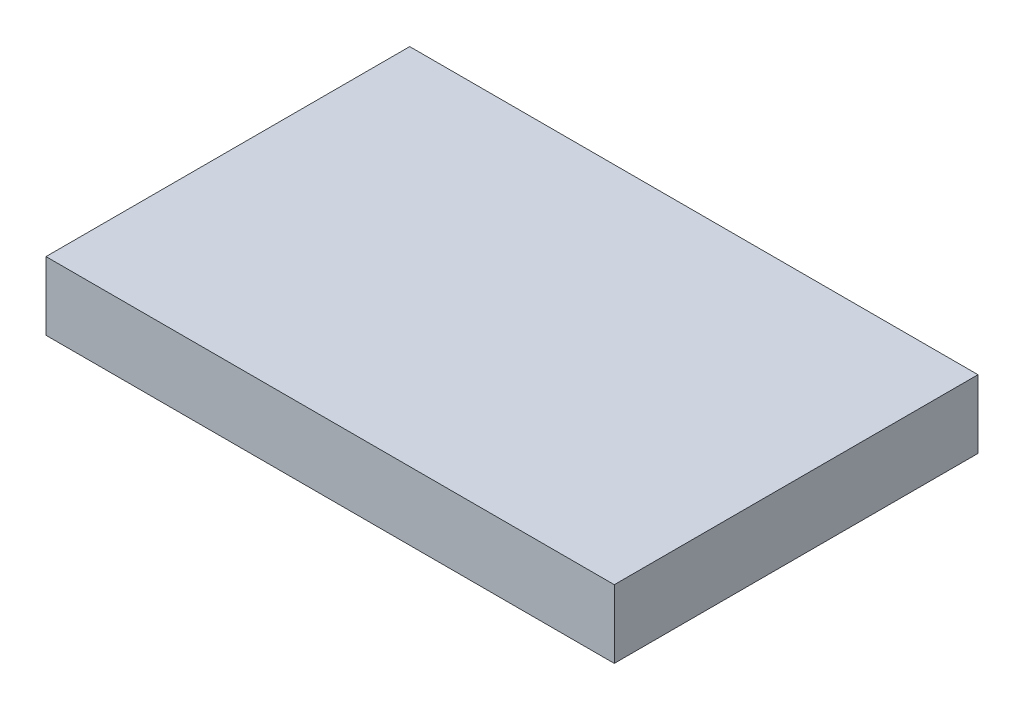
ISO-10303-21;
HEADER;
FILE_DESCRIPTION(('STEP AP214'),'2;1');
FILE_NAME('part.step','',(''),(''),'','','');
FILE_SCHEMA(('AUTOMOTIVE_DESIGN { 1 0 10303 214 1 1 1 1 }'));
ENDSEC;
DATA;
#1=APPLICATION_CONTEXT('core data for automotive mechanical design processes');
#2=APPLICATION_PROTOCOL_DEFINITION('international standard','automotive_design',2000,#1);
#3=PRODUCT_CONTEXT('',#1,'mechanical');
#4=PRODUCT('Part','Part','',(#3));
#5=PRODUCT_RELATED_PRODUCT_CATEGORY('part','',(#4));
#6=PRODUCT_DEFINITION_FORMATION('','',#4);
#7=PRODUCT_DEFINITION_CONTEXT('part definition',#1,'design');
#8=PRODUCT_DEFINITION('design','',#6,#7);
#9=PRODUCT_DEFINITION_SHAPE('','',#8);
#10=(LENGTH_UNIT() NAMED_UNIT(*) SI_UNIT(.MILLI.,.METRE.));
#11=(NAMED_UNIT(*) PLANE_ANGLE_UNIT() SI_UNIT($,.RADIAN.));
#12=(NAMED_UNIT(*) SI_UNIT($,.STERADIAN.) SOLID_ANGLE_UNIT());
#13=UNCERTAINTY_MEASURE_WITH_UNIT(LENGTH_MEASURE(1.E-05),#10,'distance_accuracy_value','');
#14=(GEOMETRIC_REPRESENTATION_CONTEXT(3) GLOBAL_UNCERTAINTY_ASSIGNED_CONTEXT((#13)) GLOBAL_UNIT_ASSIGNED_CONTEXT((#10,
#11,#12)) REPRESENTATION_CONTEXT('',''));
#15=CARTESIAN_POINT('',(0.,0.,0.));
#16=DIRECTION('',(0.,0.,1.));
#17=DIRECTION('',(1.,0.,0.));
#18=AXIS2_PLACEMENT_3D('',#15,#16,#17);
#19=CARTESIAN_POINT('',(12.5,3.,8.));
#20=DIRECTION('',(-1.,0.,0.));
#21=DIRECTION('',(0.,0.,1.));
#22=AXIS2_PLACEMENT_3D('',#19,#20,#21);
#23=PLANE('',#22);
#24=DIRECTION('',(0.,0.,-1.));
#25=VECTOR('',#24,1.);
#26=CARTESIAN_POINT('',(12.5,0.,8.));
#27=LINE('',#26,#25);
#28=CARTESIAN_POINT('',(12.5,0.,8.));
#29=VERTEX_POINT('',#28);
#30=CARTESIAN_POINT('',(12.5,0.,-8.));
#31=VERTEX_POINT('',#30);
#32=EDGE_CURVE('E113',#29,#31,#27,.T.);
#33=ORIENTED_EDGE('',*,*,#32,.T.);
#34=DIRECTION('',(0.,-1.,0.));
#35=VECTOR('',#34,1.);
#36=CARTESIAN_POINT('',(12.5,3.,-8.));
#37=LINE('',#36,#35);
#38=CARTESIAN_POINT('',(12.5,3.,-8.));
#39=VERTEX_POINT('',#38);
#40=EDGE_CURVE('E11',#39,#31,#37,.T.);
#41=ORIENTED_EDGE('',*,*,#40,.F.);
#42=DIRECTION('',(0.,0.,-1.));
#43=VECTOR('',#42,1.);
#44=CARTESIAN_POINT('',(12.5,3.,8.));
#45=LINE('',#44,#43);
#46=CARTESIAN_POINT('',(12.5,3.,8.));
#47=VERTEX_POINT('',#46);
#48=EDGE_CURVE('E97',#47,#39,#45,.T.);
#49=ORIENTED_EDGE('',*,*,#48,.F.);
#50=DIRECTION('',(0.,-1.,0.));
#51=VECTOR('',#50,1.);
#52=CARTESIAN_POINT('',(12.5,3.,8.));
#53=LINE('',#52,#51);
#54=EDGE_CURVE('E109',#47,#29,#53,.T.);
#55=ORIENTED_EDGE('',*,*,#54,.T.);
#56=EDGE_LOOP('',(#33,#41,#49,#55));
#57=FACE_BOUND('',#56,.T.);
#58=ADVANCED_FACE('F45',(#57),#23,.F.);
#59=CARTESIAN_POINT('',(-12.5,3.,-8.));
#60=DIRECTION('',(0.,0.,1.));
#61=DIRECTION('',(1.,0.,0.));
#62=AXIS2_PLACEMENT_3D('',#59,#60,#61);
#63=PLANE('',#62);
#64=DIRECTION('',(-1.,0.,0.));
#65=VECTOR('',#64,1.);
#66=CARTESIAN_POINT('',(-12.5,0.,-8.));
#67=LINE('',#66,#65);
#68=CARTESIAN_POINT('',(-12.5,0.,-8.));
#69=VERTEX_POINT('',#68);
#70=EDGE_CURVE('E102',#31,#69,#67,.T.);
#71=ORIENTED_EDGE('',*,*,#70,.T.);
#72=DIRECTION('',(0.,-1.,0.));
#73=VECTOR('',#72,1.);
#74=CARTESIAN_POINT('',(-12.5,3.,-8.));
#75=LINE('',#74,#73);
#76=CARTESIAN_POINT('',(-12.5,3.,-8.));
#77=VERTEX_POINT('',#76);
#78=EDGE_CURVE('E54',#77,#69,#75,.T.);
#79=ORIENTED_EDGE('',*,*,#78,.F.);
#80=DIRECTION('',(-1.,0.,0.));
#81=VECTOR('',#80,1.);
#82=CARTESIAN_POINT('',(-12.5,3.,-8.));
#83=LINE('',#82,#81);
#84=EDGE_CURVE('E92',#39,#77,#83,.T.);
#85=ORIENTED_EDGE('',*,*,#84,.F.);
#86=ORIENTED_EDGE('',*,*,#40,.T.);
#87=EDGE_LOOP('',(#71,#79,#85,#86));
#88=FACE_BOUND('',#87,.T.);
#89=ADVANCED_FACE('F101',(#88),#63,.F.);
#90=CARTESIAN_POINT('',(-12.5,3.,8.));
#91=DIRECTION('',(1.,0.,0.));
#92=DIRECTION('',(0.,0.,-1.));
#93=AXIS2_PLACEMENT_3D('',#90,#91,#92);
#94=PLANE('',#93);
#95=DIRECTION('',(0.,0.,1.));
#96=VECTOR('',#95,1.);
#97=CARTESIAN_POINT('',(-12.5,0.,8.));
#98=LINE('',#97,#96);
#99=CARTESIAN_POINT('',(-12.5,0.,8.));
#100=VERTEX_POINT('',#99);
#101=EDGE_CURVE('E79',#69,#100,#98,.T.);
#102=ORIENTED_EDGE('',*,*,#101,.T.);
#103=DIRECTION('',(0.,-1.,0.));
#104=VECTOR('',#103,1.);
#105=CARTESIAN_POINT('',(-12.5,3.,8.));
#106=LINE('',#105,#104);
#107=CARTESIAN_POINT('',(-12.5,3.,8.));
#108=VERTEX_POINT('',#107);
#109=EDGE_CURVE('E104',#108,#100,#106,.T.);
#110=ORIENTED_EDGE('',*,*,#109,.F.);
#111=DIRECTION('',(0.,0.,1.));
#112=VECTOR('',#111,1.);
#113=CARTESIAN_POINT('',(-12.5,3.,8.));
#114=LINE('',#113,#112);
#115=EDGE_CURVE('E95',#77,#108,#114,.T.);
#116=ORIENTED_EDGE('',*,*,#115,.F.);
#117=ORIENTED_EDGE('',*,*,#78,.T.);
#118=EDGE_LOOP('',(#102,#110,#116,#117));
#119=FACE_BOUND('',#118,.T.);
#120=ADVANCED_FACE('F105',(#119),#94,.F.);
#121=CARTESIAN_POINT('',(-12.5,3.,8.));
#122=DIRECTION('',(0.,0.,-1.));
#123=DIRECTION('',(-1.,0.,0.));
#124=AXIS2_PLACEMENT_3D('',#121,#122,#123);
#125=PLANE('',#124);
#126=DIRECTION('',(1.,0.,0.));
#127=VECTOR('',#126,1.);
#128=CARTESIAN_POINT('',(-12.5,0.,8.));
#129=LINE('',#128,#127);
#130=EDGE_CURVE('E85',#100,#29,#129,.T.);
#131=ORIENTED_EDGE('',*,*,#130,.T.);
#132=ORIENTED_EDGE('',*,*,#54,.F.);
#133=DIRECTION('',(1.,0.,0.));
#134=VECTOR('',#133,1.);
#135=CARTESIAN_POINT('',(-12.5,3.,8.));
#136=LINE('',#135,#134);
#137=EDGE_CURVE('E62',#108,#47,#136,.T.);
#138=ORIENTED_EDGE('',*,*,#137,.F.);
#139=ORIENTED_EDGE('',*,*,#109,.T.);
#140=EDGE_LOOP('',(#131,#132,#138,#139));
#141=FACE_BOUND('',#140,.T.);
#142=ADVANCED_FACE('F126',(#141),#125,.F.);
#143=CARTESIAN_POINT('',(0.,3.,0.));
#144=DIRECTION('',(0.,-1.,0.));
#145=DIRECTION('',(0.,0.,-1.));
#146=AXIS2_PLACEMENT_3D('',#143,#144,#145);
#147=PLANE('',#146);
#148=ORIENTED_EDGE('',*,*,#48,.T.);
#149=ORIENTED_EDGE('',*,*,#84,.T.);
#150=ORIENTED_EDGE('',*,*,#115,.T.);
#151=ORIENTED_EDGE('',*,*,#137,.T.);
#152=EDGE_LOOP('',(#148,#149,#150,#151));
#153=FACE_BOUND('',#152,.T.);
#154=ADVANCED_FACE('F93',(#153),#147,.F.);
#155=CARTESIAN_POINT('',(0.,0.,0.));
#156=DIRECTION('',(0.,-1.,0.));
#157=DIRECTION('',(0.,0.,-1.));
#158=AXIS2_PLACEMENT_3D('',#155,#156,#157);
#159=PLANE('',#158);
#160=ORIENTED_EDGE('',*,*,#32,.F.);
#161=ORIENTED_EDGE('',*,*,#130,.F.);
#162=ORIENTED_EDGE('',*,*,#101,.F.);
#163=ORIENTED_EDGE('',*,*,#70,.F.);
#164=EDGE_LOOP('',(#160,#161,#162,#163));
#165=FACE_BOUND('',#164,.T.);
#166=ADVANCED_FACE('F129',(#165),#159,.T.);
#167=CLOSED_SHELL('',(#58,#89,#120,#142,#154,#166));
#168=MANIFOLD_SOLID_BREP('B2',#167);
#169=ADVANCED_BREP_SHAPE_REPRESENTATION('',(#18,#168),#14);
#170=SHAPE_DEFINITION_REPRESENTATION(#9,#169);
ENDSEC;
END-ISO-10303-21;
